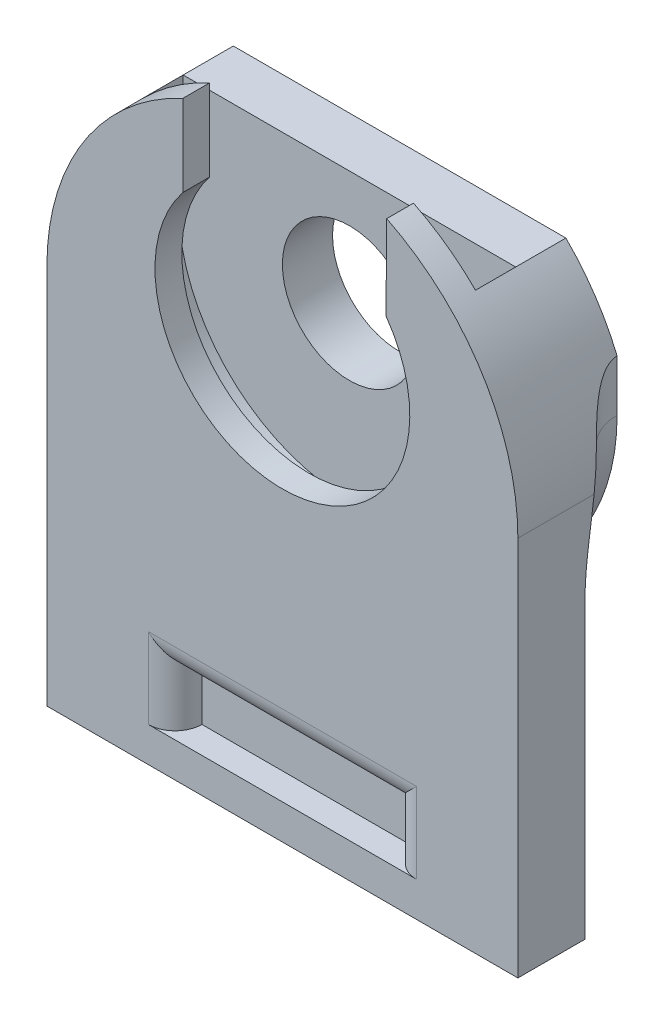
ISO-10303-21;
HEADER;
FILE_DESCRIPTION(('STEP AP214'),'2;1');
FILE_NAME('part.step','',(''),(''),'','','');
FILE_SCHEMA(('AUTOMOTIVE_DESIGN { 1 0 10303 214 1 1 1 1 }'));
ENDSEC;
DATA;
#1=APPLICATION_CONTEXT('core data for automotive mechanical design processes');
#2=APPLICATION_PROTOCOL_DEFINITION('international standard','automotive_design',2000,#1);
#3=PRODUCT_CONTEXT('',#1,'mechanical');
#4=PRODUCT('Part','Part','',(#3));
#5=PRODUCT_RELATED_PRODUCT_CATEGORY('part','',(#4));
#6=PRODUCT_DEFINITION_FORMATION('','',#4);
#7=PRODUCT_DEFINITION_CONTEXT('part definition',#1,'design');
#8=PRODUCT_DEFINITION('design','',#6,#7);
#9=PRODUCT_DEFINITION_SHAPE('','',#8);
#10=(LENGTH_UNIT() NAMED_UNIT(*) SI_UNIT(.MILLI.,.METRE.));
#11=(NAMED_UNIT(*) PLANE_ANGLE_UNIT() SI_UNIT($,.RADIAN.));
#12=(NAMED_UNIT(*) SI_UNIT($,.STERADIAN.) SOLID_ANGLE_UNIT());
#13=UNCERTAINTY_MEASURE_WITH_UNIT(LENGTH_MEASURE(1.E-05),#10,'distance_accuracy_value','');
#14=(GEOMETRIC_REPRESENTATION_CONTEXT(3) GLOBAL_UNCERTAINTY_ASSIGNED_CONTEXT((#13)) GLOBAL_UNIT_ASSIGNED_CONTEXT((#10,
#11,#12)) REPRESENTATION_CONTEXT('',''));
#15=CARTESIAN_POINT('',(0.,0.,0.));
#16=DIRECTION('',(0.,0.,1.));
#17=DIRECTION('',(1.,0.,0.));
#18=AXIS2_PLACEMENT_3D('',#15,#16,#17);
#19=CARTESIAN_POINT('',(8.78,8.5,1.5));
#20=DIRECTION('',(0.,0.,-1.));
#21=DIRECTION('',(-1.,0.,0.));
#22=AXIS2_PLACEMENT_3D('',#19,#20,#21);
#23=CYLINDRICAL_SURFACE('',#22,6.375);
#24=DIRECTION('',(0.,0.,-1.));
#25=VECTOR('',#24,1.);
#26=CARTESIAN_POINT('',(2.58,9.98345036991469,1.5));
#27=LINE('',#26,#25);
#28=CARTESIAN_POINT('',(2.58,9.98345036991469,1.5));
#29=VERTEX_POINT('',#28);
#30=CARTESIAN_POINT('',(2.58,9.98345036991469,0.));
#31=VERTEX_POINT('',#30);
#32=EDGE_CURVE('E260',#29,#31,#27,.T.);
#33=ORIENTED_EDGE('',*,*,#32,.F.);
#34=CARTESIAN_POINT('',(8.78,8.5,1.5));
#35=DIRECTION('',(0.,0.,1.));
#36=DIRECTION('',(1.,0.,0.));
#37=AXIS2_PLACEMENT_3D('',#34,#35,#36);
#38=CIRCLE('',#37,6.375);
#39=CARTESIAN_POINT('',(14.98,9.98345036991469,1.5));
#40=VERTEX_POINT('',#39);
#41=EDGE_CURVE('E265',#29,#40,#38,.T.);
#42=ORIENTED_EDGE('',*,*,#41,.T.);
#43=DIRECTION('',(0.,0.,-1.));
#44=VECTOR('',#43,1.);
#45=CARTESIAN_POINT('',(14.98,9.98345036991469,1.5));
#46=LINE('',#45,#44);
#47=CARTESIAN_POINT('',(14.98,9.98345036991469,0.));
#48=VERTEX_POINT('',#47);
#49=EDGE_CURVE('E263',#48,#40,#46,.F.);
#50=ORIENTED_EDGE('',*,*,#49,.F.);
#51=CARTESIAN_POINT('',(8.78,8.5,0.));
#52=DIRECTION('',(0.,0.,1.));
#53=DIRECTION('',(1.,0.,0.));
#54=AXIS2_PLACEMENT_3D('',#51,#52,#53);
#55=CIRCLE('',#54,6.375);
#56=EDGE_CURVE('E297',#31,#48,#55,.T.);
#57=ORIENTED_EDGE('',*,*,#56,.F.);
#58=EDGE_LOOP('',(#33,#42,#50,#57));
#59=FACE_BOUND('',#58,.T.);
#60=ADVANCED_FACE('F35',(#59),#23,.F.);
#61=CARTESIAN_POINT('',(0.,0.,0.));
#62=DIRECTION('',(0.,0.,1.));
#63=DIRECTION('',(1.,0.,0.));
#64=AXIS2_PLACEMENT_3D('',#61,#62,#63);
#65=PLANE('',#64);
#66=DIRECTION('',(1.,0.,0.));
#67=VECTOR('',#66,1.);
#68=CARTESIAN_POINT('',(0.,-1.87,0.));
#69=LINE('',#68,#67);
#70=CARTESIAN_POINT('',(8.67061038055273,-1.87,0.));
#71=VERTEX_POINT('',#70);
#72=CARTESIAN_POINT('',(8.88938961944725,-1.87,0.));
#73=VERTEX_POINT('',#72);
#74=EDGE_CURVE('E362',#71,#73,#69,.T.);
#75=ORIENTED_EDGE('',*,*,#74,.T.);
#76=CARTESIAN_POINT('',(8.88938961944732,8.,0.));
#77=DIRECTION('',(0.,0.,1.));
#78=DIRECTION('',(1.,0.,0.));
#79=AXIS2_PLACEMENT_3D('',#76,#77,#78);
#80=CIRCLE('',#79,9.87);
#81=CARTESIAN_POINT('',(17.56,3.28434356333583,0.));
#82=VERTEX_POINT('',#81);
#83=EDGE_CURVE('E211',#73,#82,#80,.T.);
#84=ORIENTED_EDGE('',*,*,#83,.T.);
#85=DIRECTION('',(0.,1.,0.));
#86=VECTOR('',#85,1.);
#87=CARTESIAN_POINT('',(17.56,0.,0.));
#88=LINE('',#87,#86);
#89=CARTESIAN_POINT('',(17.56,-7.65,0.));
#90=VERTEX_POINT('',#89);
#91=EDGE_CURVE('E301',#90,#82,#88,.T.);
#92=ORIENTED_EDGE('',*,*,#91,.F.);
#93=DIRECTION('',(1.,0.,0.));
#94=VECTOR('',#93,1.);
#95=CARTESIAN_POINT('',(0.,-7.65,0.));
#96=LINE('',#95,#94);
#97=CARTESIAN_POINT('',(0.,-7.65,0.));
#98=VERTEX_POINT('',#97);
#99=EDGE_CURVE('E321',#98,#90,#96,.T.);
#100=ORIENTED_EDGE('',*,*,#99,.F.);
#101=DIRECTION('',(0.,1.,0.));
#102=VECTOR('',#101,1.);
#103=CARTESIAN_POINT('',(0.,0.,0.));
#104=LINE('',#103,#102);
#105=CARTESIAN_POINT('',(0.,3.28434356333583,0.));
#106=VERTEX_POINT('',#105);
#107=EDGE_CURVE('E307',#98,#106,#104,.T.);
#108=ORIENTED_EDGE('',*,*,#107,.T.);
#109=CARTESIAN_POINT('',(8.67061038055268,8.,0.));
#110=DIRECTION('',(0.,0.,1.));
#111=DIRECTION('',(1.,0.,0.));
#112=AXIS2_PLACEMENT_3D('',#109,#110,#111);
#113=CIRCLE('',#112,9.87);
#114=EDGE_CURVE('E360',#106,#71,#113,.T.);
#115=ORIENTED_EDGE('',*,*,#114,.T.);
#116=EDGE_LOOP('',(#75,#84,#92,#100,#108,#115));
#117=FACE_BOUND('',#116,.T.);
#118=ADVANCED_FACE('F435',(#117),#65,.F.);
#119=CARTESIAN_POINT('',(0.,0.,1.5));
#120=DIRECTION('',(0.,0.,1.));
#121=DIRECTION('',(1.,0.,0.));
#122=AXIS2_PLACEMENT_3D('',#119,#120,#121);
#123=PLANE('',#122);
#124=DIRECTION('',(0.,1.,0.));
#125=VECTOR('',#124,1.);
#126=CARTESIAN_POINT('',(5.07,0.,1.5));
#127=LINE('',#126,#125);
#128=CARTESIAN_POINT('',(5.07,11.466209702634,1.5));
#129=VERTEX_POINT('',#128);
#130=CARTESIAN_POINT('',(5.07,14.5076566902575,1.5));
#131=VERTEX_POINT('',#130);
#132=EDGE_CURVE('E274',#129,#131,#127,.T.);
#133=ORIENTED_EDGE('',*,*,#132,.F.);
#134=CARTESIAN_POINT('',(8.78,8.5,1.5));
#135=DIRECTION('',(0.,0.,-1.));
#136=DIRECTION('',(-1.,0.,0.));
#137=AXIS2_PLACEMENT_3D('',#134,#135,#136);
#138=CIRCLE('',#137,4.75);
#139=CARTESIAN_POINT('',(12.642805753353,11.2642777920939,1.5));
#140=VERTEX_POINT('',#139);
#141=EDGE_CURVE('E303',#140,#129,#138,.T.);
#142=ORIENTED_EDGE('',*,*,#141,.F.);
#143=DIRECTION('',(-0.00807220354177865,-0.999967419234237,0.));
#144=VECTOR('',#143,1.);
#145=CARTESIAN_POINT('',(12.5510573615878,-0.101317990704999,1.5));
#146=LINE('',#145,#144);
#147=CARTESIAN_POINT('',(12.6682969564391,14.4220738549982,1.5));
#148=VERTEX_POINT('',#147);
#149=EDGE_CURVE('E340',#148,#140,#146,.T.);
#150=ORIENTED_EDGE('',*,*,#149,.F.);
#151=CARTESIAN_POINT('',(8.78,6.55,1.5));
#152=DIRECTION('',(0.,0.,1.));
#153=DIRECTION('',(1.,0.,0.));
#154=AXIS2_PLACEMENT_3D('',#151,#152,#153);
#155=CIRCLE('',#154,8.78);
#156=CARTESIAN_POINT('',(14.98,12.7667837343758,1.5));
#157=VERTEX_POINT('',#156);
#158=EDGE_CURVE('E252',#157,#148,#155,.T.);
#159=ORIENTED_EDGE('',*,*,#158,.F.);
#160=DIRECTION('',(0.,-1.,0.));
#161=VECTOR('',#160,1.);
#162=CARTESIAN_POINT('',(14.98,8.50000000000001,1.5));
#163=LINE('',#162,#161);
#164=EDGE_CURVE('E249',#157,#40,#163,.T.);
#165=ORIENTED_EDGE('',*,*,#164,.T.);
#166=ORIENTED_EDGE('',*,*,#41,.F.);
#167=DIRECTION('',(0.,1.,0.));
#168=VECTOR('',#167,1.);
#169=CARTESIAN_POINT('',(2.58,8.50000000000001,1.5));
#170=LINE('',#169,#168);
#171=CARTESIAN_POINT('',(2.58,12.7667837343758,1.5));
#172=VERTEX_POINT('',#171);
#173=EDGE_CURVE('E246',#29,#172,#170,.T.);
#174=ORIENTED_EDGE('',*,*,#173,.T.);
#175=CARTESIAN_POINT('',(8.78,6.55,1.5));
#176=DIRECTION('',(0.,0.,1.));
#177=DIRECTION('',(1.,0.,0.));
#178=AXIS2_PLACEMENT_3D('',#175,#176,#177);
#179=CIRCLE('',#178,8.78);
#180=EDGE_CURVE('E257',#131,#172,#179,.T.);
#181=ORIENTED_EDGE('',*,*,#180,.F.);
#182=EDGE_LOOP('',(#133,#142,#150,#159,#165,#166,#174,#181));
#183=FACE_BOUND('',#182,.T.);
#184=ADVANCED_FACE('F440',(#183),#123,.F.);
#185=CARTESIAN_POINT('',(0.,0.,2.5));
#186=DIRECTION('',(0.,0.,1.));
#187=DIRECTION('',(1.,0.,0.));
#188=AXIS2_PLACEMENT_3D('',#185,#186,#187);
#189=PLANE('',#188);
#190=DIRECTION('',(0.,1.,0.));
#191=VECTOR('',#190,1.);
#192=CARTESIAN_POINT('',(13.78,-6.35316683145248,2.5));
#193=LINE('',#192,#191);
#194=CARTESIAN_POINT('',(13.78,-3.35316683145248,2.5));
#195=VERTEX_POINT('',#194);
#196=CARTESIAN_POINT('',(13.78,-6.35316683145248,2.5));
#197=VERTEX_POINT('',#196);
#198=EDGE_CURVE('E294',#195,#197,#193,.F.);
#199=ORIENTED_EDGE('',*,*,#198,.T.);
#200=DIRECTION('',(1.,0.,0.));
#201=VECTOR('',#200,1.);
#202=CARTESIAN_POINT('',(12.78,-6.35316683145248,2.5));
#203=LINE('',#202,#201);
#204=CARTESIAN_POINT('',(3.78,-6.35316683145248,2.5));
#205=VERTEX_POINT('',#204);
#206=EDGE_CURVE('E287',#205,#197,#203,.T.);
#207=ORIENTED_EDGE('',*,*,#206,.F.);
#208=DIRECTION('',(0.,-1.,0.));
#209=VECTOR('',#208,1.);
#210=CARTESIAN_POINT('',(3.78,-4.35316683145248,2.5));
#211=LINE('',#210,#209);
#212=CARTESIAN_POINT('',(3.78,-3.35316683145248,2.5));
#213=VERTEX_POINT('',#212);
#214=EDGE_CURVE('E291',#205,#213,#211,.F.);
#215=ORIENTED_EDGE('',*,*,#214,.T.);
#216=DIRECTION('',(-1.,0.,0.));
#217=VECTOR('',#216,1.);
#218=CARTESIAN_POINT('',(12.78,-3.35316683145248,2.5));
#219=LINE('',#218,#217);
#220=EDGE_CURVE('E293',#213,#195,#219,.F.);
#221=ORIENTED_EDGE('',*,*,#220,.T.);
#222=EDGE_LOOP('',(#199,#207,#215,#221));
#223=FACE_BOUND('',#222,.T.);
#224=CARTESIAN_POINT('',(8.78,6.55,2.5));
#225=DIRECTION('',(0.,0.,1.));
#226=DIRECTION('',(1.,0.,0.));
#227=AXIS2_PLACEMENT_3D('',#224,#225,#226);
#228=CIRCLE('',#227,8.78);
#229=CARTESIAN_POINT('',(17.56,6.55,2.5));
#230=VERTEX_POINT('',#229);
#231=CARTESIAN_POINT('',(12.6682969564391,14.4220738549982,2.5));
#232=VERTEX_POINT('',#231);
#233=EDGE_CURVE('E299',#230,#232,#228,.T.);
#234=ORIENTED_EDGE('',*,*,#233,.T.);
#235=DIRECTION('',(-0.00807220354177865,-0.999967419234237,0.));
#236=VECTOR('',#235,1.);
#237=CARTESIAN_POINT('',(12.6696430470026,14.588824693216,2.5));
#238=LINE('',#237,#236);
#239=CARTESIAN_POINT('',(12.642805753353,11.2642777920939,2.5));
#240=VERTEX_POINT('',#239);
#241=EDGE_CURVE('E345',#232,#240,#238,.T.);
#242=ORIENTED_EDGE('',*,*,#241,.T.);
#243=CARTESIAN_POINT('',(8.78,8.5,2.5));
#244=DIRECTION('',(0.,0.,-1.));
#245=DIRECTION('',(-1.,0.,0.));
#246=AXIS2_PLACEMENT_3D('',#243,#244,#245);
#247=CIRCLE('',#246,4.75);
#248=CARTESIAN_POINT('',(5.07,11.466209702634,2.5));
#249=VERTEX_POINT('',#248);
#250=EDGE_CURVE('E317',#240,#249,#247,.T.);
#251=ORIENTED_EDGE('',*,*,#250,.T.);
#252=DIRECTION('',(0.,-1.,0.));
#253=VECTOR('',#252,1.);
#254=CARTESIAN_POINT('',(5.07,14.6194981256581,2.5));
#255=LINE('',#254,#253);
#256=CARTESIAN_POINT('',(5.07,14.5076566902575,2.5));
#257=VERTEX_POINT('',#256);
#258=EDGE_CURVE('E275',#257,#249,#255,.T.);
#259=ORIENTED_EDGE('',*,*,#258,.F.);
#260=CARTESIAN_POINT('',(8.78,6.55,2.5));
#261=DIRECTION('',(0.,0.,1.));
#262=DIRECTION('',(1.,0.,0.));
#263=AXIS2_PLACEMENT_3D('',#260,#261,#262);
#264=CIRCLE('',#263,8.78);
#265=CARTESIAN_POINT('',(0.,6.55,2.5));
#266=VERTEX_POINT('',#265);
#267=EDGE_CURVE('E315',#257,#266,#264,.T.);
#268=ORIENTED_EDGE('',*,*,#267,.T.);
#269=DIRECTION('',(0.,-1.,0.));
#270=VECTOR('',#269,1.);
#271=CARTESIAN_POINT('',(0.,0.,2.5));
#272=LINE('',#271,#270);
#273=CARTESIAN_POINT('',(0.,-7.65,2.5));
#274=VERTEX_POINT('',#273);
#275=EDGE_CURVE('E313',#266,#274,#272,.T.);
#276=ORIENTED_EDGE('',*,*,#275,.T.);
#277=DIRECTION('',(-1.,0.,0.));
#278=VECTOR('',#277,1.);
#279=CARTESIAN_POINT('',(17.56,-7.65,2.5));
#280=LINE('',#279,#278);
#281=CARTESIAN_POINT('',(17.56,-7.65,2.5));
#282=VERTEX_POINT('',#281);
#283=EDGE_CURVE('E306',#282,#274,#280,.T.);
#284=ORIENTED_EDGE('',*,*,#283,.F.);
#285=DIRECTION('',(0.,1.,0.));
#286=VECTOR('',#285,1.);
#287=CARTESIAN_POINT('',(17.56,0.,2.5));
#288=LINE('',#287,#286);
#289=EDGE_CURVE('E310',#282,#230,#288,.T.);
#290=ORIENTED_EDGE('',*,*,#289,.T.);
#291=EDGE_LOOP('',(#234,#242,#251,#259,#268,#276,#284,#290));
#292=FACE_BOUND('',#291,.T.);
#293=ADVANCED_FACE('F481',(#223,#292),#189,.T.);
#294=CARTESIAN_POINT('',(8.78,8.5,2.5));
#295=DIRECTION('',(0.,0.,-1.));
#296=DIRECTION('',(-1.,0.,0.));
#297=AXIS2_PLACEMENT_3D('',#294,#295,#296);
#298=CYLINDRICAL_SURFACE('',#297,4.75);
#299=DIRECTION('',(0.,0.,-1.));
#300=VECTOR('',#299,1.);
#301=CARTESIAN_POINT('',(12.642805753353,11.2642777920939,2.5));
#302=LINE('',#301,#300);
#303=EDGE_CURVE('E270',#140,#240,#302,.F.);
#304=ORIENTED_EDGE('',*,*,#303,.F.);
#305=ORIENTED_EDGE('',*,*,#141,.T.);
#306=DIRECTION('',(0.,0.,-1.));
#307=VECTOR('',#306,1.);
#308=CARTESIAN_POINT('',(5.07,11.466209702634,2.5));
#309=LINE('',#308,#307);
#310=EDGE_CURVE('E271',#249,#129,#309,.T.);
#311=ORIENTED_EDGE('',*,*,#310,.F.);
#312=ORIENTED_EDGE('',*,*,#250,.F.);
#313=EDGE_LOOP('',(#304,#305,#311,#312));
#314=FACE_BOUND('',#313,.T.);
#315=ADVANCED_FACE('F477',(#314),#298,.F.);
#316=CARTESIAN_POINT('',(8.78,6.55,1.5));
#317=DIRECTION('',(0.,0.,-1.));
#318=DIRECTION('',(-1.,0.,0.));
#319=AXIS2_PLACEMENT_3D('',#316,#317,#318);
#320=CYLINDRICAL_SURFACE('',#319,8.78);
#321=DIRECTION('',(0.,0.,-1.));
#322=VECTOR('',#321,1.);
#323=CARTESIAN_POINT('',(17.56,6.55,1.5));
#324=LINE('',#323,#322);
#325=CARTESIAN_POINT('',(17.56,6.55,-0.342683321896948));
#326=VERTEX_POINT('',#325);
#327=EDGE_CURVE('E60',#230,#326,#324,.T.);
#328=ORIENTED_EDGE('',*,*,#327,.T.);
#329=CARTESIAN_POINT('',(17.56,6.55,-0.342683321896974));
#330=CARTESIAN_POINT('',(17.5599994901147,6.67037660131197,-0.35671167158142));
#331=CARTESIAN_POINT('',(17.5575236596443,6.79066400091637,-0.371332129180917));
#332=CARTESIAN_POINT('',(17.5476461540936,7.03087339045183,-0.401855343694858));
#333=CARTESIAN_POINT('',(17.5402444716129,7.15079537983364,-0.417758102535736));
#334=CARTESIAN_POINT('',(17.5108337070411,7.50796091414598,-0.467291244716296));
#335=CARTESIAN_POINT('',(17.4816176288962,7.74439159734278,-0.502951421287838));
#336=CARTESIAN_POINT('',(17.423687478412,8.09569152314312,-0.561242833021924));
#337=CARTESIAN_POINT('',(17.4020377408094,8.21218851916515,-0.581464572327461));
#338=CARTESIAN_POINT('',(17.3541179059053,8.44390919805024,-0.623703887528542));
#339=CARTESIAN_POINT('',(17.3278478931744,8.5591329041789,-0.645721430549274));
#340=CARTESIAN_POINT('',(17.2705804806016,8.78887359493945,-0.691938212187154));
#341=CARTESIAN_POINT('',(17.2395503218659,8.90337947248323,-0.716152053438081));
#342=CARTESIAN_POINT('',(17.1730401995582,9.1305634459637,-0.766968874434136));
#343=CARTESIAN_POINT('',(17.1375598778429,9.24324139396584,-0.793572046420489));
#344=CARTESIAN_POINT('',(17.0999255557617,9.35485984437417,-0.821540206190086));
#345=B_SPLINE_CURVE_WITH_KNOTS('',3,(#329,#330,#331,#332,#333,#334,#335,#336,#337,#338,#339,
#340,#341,#342,#343,#344),.UNSPECIFIED.,.F.,.F.,(4,2,2,2,2,2,2,4),(0.,0.363506662577323,
0.727013871270572,1.44864682998518,1.80917898034457,2.16970453211661,2.53283279418548,
2.89599029911484),.UNSPECIFIED.);
#346=CARTESIAN_POINT('',(17.4394399356999,8.00000000000208,-0.545374455789477));
#347=VERTEX_POINT('',#346);
#348=EDGE_CURVE('E421',#326,#347,#345,.T.);
#349=ORIENTED_EDGE('',*,*,#348,.T.);
#350=CARTESIAN_POINT('',(17.4394399356999,8.00000000000208,-0.545374455789477));
#351=CARTESIAN_POINT('',(17.4313492092322,8.04831940742578,-0.553438926138364));
#352=CARTESIAN_POINT('',(17.422868242472,8.09648283253569,-0.562034990228973));
#353=CARTESIAN_POINT('',(17.4051447896824,8.19245522292477,-0.58039360138816));
#354=CARTESIAN_POINT('',(17.3959021597235,8.24026411934049,-0.590156369083462));
#355=CARTESIAN_POINT('',(17.3669888688589,8.38344513482413,-0.621427269915909));
#356=CARTESIAN_POINT('',(17.3461972466878,8.47818771111612,-0.644855724289133));
#357=CARTESIAN_POINT('',(17.3017019626057,8.66622837993129,-0.698136139538963));
#358=CARTESIAN_POINT('',(17.2779716599578,8.75950308598486,-0.728049037880533));
#359=CARTESIAN_POINT('',(17.2282798957079,8.94247022245388,-0.795585259795686));
#360=CARTESIAN_POINT('',(17.2023228238173,9.03216921253757,-0.833193607060311));
#361=CARTESIAN_POINT('',(17.1564131451809,9.18219319961071,-0.906324830809631));
#362=CARTESIAN_POINT('',(17.1367983878255,9.24374937799241,-0.939518656869987));
#363=CARTESIAN_POINT('',(17.0973576667259,9.36316626285291,-1.01194827523123));
#364=CARTESIAN_POINT('',(17.0775317757331,9.42102819708214,-1.05118204526517));
#365=CARTESIAN_POINT('',(17.038273216599,9.53208391121,-1.13724886848081));
#366=CARTESIAN_POINT('',(17.0188467391315,9.58522319916312,-1.18415634623671));
#367=CARTESIAN_POINT('',(16.9819568190609,9.68353505809272,-1.286415761797));
#368=CARTESIAN_POINT('',(16.9644887367788,9.72872660929825,-1.3417469758253));
#369=CARTESIAN_POINT('',(16.939185814112,9.79296490934671,-1.43954083091247));
#370=CARTESIAN_POINT('',(16.930158421708,9.8155417681463,-1.47936094232775));
#371=CARTESIAN_POINT('',(16.9144089988451,9.85457725174302,-1.56223549444583));
#372=CARTESIAN_POINT('',(16.9076804105711,9.87105329185363,-1.60528030037213));
#373=CARTESIAN_POINT('',(16.8971431702515,9.89672796570826,-1.6941140832135));
#374=CARTESIAN_POINT('',(16.8933470483979,9.90589537554783,-1.73991394450203));
#375=CARTESIAN_POINT('',(16.8902165472607,9.9134495340228,-1.80961598706448));
#376=CARTESIAN_POINT('',(16.8896045170286,9.91492460711805,-1.83316075952621));
#377=CARTESIAN_POINT('',(16.8892687923697,9.91573275972128,-1.88031298597487));
#378=CARTESIAN_POINT('',(16.8895458469869,9.91506403310261,-1.90392047606359));
#379=CARTESIAN_POINT('',(16.8902722385397,9.91331446890884,-1.92744750986062));
#380=B_SPLINE_CURVE_WITH_KNOTS('',3,(#350,#351,#352,#353,#354,#355,#356,#357,#358,#359,#360,
#361,#362,#363,#364,#365,#366,#367,#368,#369,#370,#371,#372,#373,#374,#375,#376,#377,#378,#379),
.UNSPECIFIED.,.F.,.F.,(4,2,2,2,2,2,2,2,2,2,2,2,2,2,4),(0.,0.148944471673248,0.297917153840309,
0.597043230068733,0.899112638413519,1.20059967942839,1.41823669194327,1.63580099405584,
1.85561627933959,2.07489927008526,2.21439905579188,2.35349750001322,2.49318706253206,
2.56388166073484,2.63463583397283),.UNSPECIFIED.);
#381=CARTESIAN_POINT('',(16.8893896194473,9.9154420214884,-1.87));
#382=VERTEX_POINT('',#381);
#383=EDGE_CURVE('E372',#347,#382,#380,.T.);
#384=ORIENTED_EDGE('',*,*,#383,.T.);
#385=CARTESIAN_POINT('',(8.78,6.55,-1.87));
#386=DIRECTION('',(0.,0.,-1.));
#387=DIRECTION('',(-1.,0.,0.));
#388=AXIS2_PLACEMENT_3D('',#385,#386,#387);
#389=CIRCLE('',#388,8.78);
#390=CARTESIAN_POINT('',(14.98,12.7667837343758,-1.87));
#391=VERTEX_POINT('',#390);
#392=EDGE_CURVE('E231',#391,#382,#389,.T.);
#393=ORIENTED_EDGE('',*,*,#392,.F.);
#394=DIRECTION('',(0.,0.,1.));
#395=VECTOR('',#394,1.);
#396=CARTESIAN_POINT('',(14.98,12.7667837343758,-1.87));
#397=LINE('',#396,#395);
#398=CARTESIAN_POINT('',(14.98,12.7667837343758,0.));
#399=VERTEX_POINT('',#398);
#400=EDGE_CURVE('E234',#391,#399,#397,.T.);
#401=ORIENTED_EDGE('',*,*,#400,.T.);
#402=DIRECTION('',(0.,0.,-1.));
#403=VECTOR('',#402,1.);
#404=CARTESIAN_POINT('',(14.98,12.7667837343758,1.5));
#405=LINE('',#404,#403);
#406=EDGE_CURVE('E357',#399,#157,#405,.F.);
#407=ORIENTED_EDGE('',*,*,#406,.T.);
#408=ORIENTED_EDGE('',*,*,#158,.T.);
#409=DIRECTION('',(0.,0.,-1.));
#410=VECTOR('',#409,1.);
#411=CARTESIAN_POINT('',(12.6682969564391,14.4220738549982,1.5));
#412=LINE('',#411,#410);
#413=EDGE_CURVE('E266',#232,#148,#412,.T.);
#414=ORIENTED_EDGE('',*,*,#413,.F.);
#415=ORIENTED_EDGE('',*,*,#233,.F.);
#416=EDGE_LOOP('',(#328,#349,#384,#393,#401,#407,#408,#414,#415));
#417=FACE_BOUND('',#416,.T.);
#418=ADVANCED_FACE('F454',(#417),#320,.T.);
#419=CARTESIAN_POINT('',(8.78,6.55,1.5));
#420=DIRECTION('',(0.,0.,-1.));
#421=DIRECTION('',(-1.,0.,0.));
#422=AXIS2_PLACEMENT_3D('',#419,#420,#421);
#423=CYLINDRICAL_SURFACE('',#422,8.78);
#424=DIRECTION('',(0.,0.,-1.));
#425=VECTOR('',#424,1.);
#426=CARTESIAN_POINT('',(5.07,14.5076566902575,1.5));
#427=LINE('',#426,#425);
#428=EDGE_CURVE('E283',#131,#257,#427,.F.);
#429=ORIENTED_EDGE('',*,*,#428,.F.);
#430=ORIENTED_EDGE('',*,*,#180,.T.);
#431=DIRECTION('',(0.,0.,-1.));
#432=VECTOR('',#431,1.);
#433=CARTESIAN_POINT('',(2.58,12.7667837343758,1.5));
#434=LINE('',#433,#432);
#435=CARTESIAN_POINT('',(2.58,12.7667837343758,0.));
#436=VERTEX_POINT('',#435);
#437=EDGE_CURVE('E269',#172,#436,#434,.T.);
#438=ORIENTED_EDGE('',*,*,#437,.T.);
#439=DIRECTION('',(0.,0.,1.));
#440=VECTOR('',#439,1.);
#441=CARTESIAN_POINT('',(2.58,12.7667837343758,-1.87));
#442=LINE('',#441,#440);
#443=CARTESIAN_POINT('',(2.58,12.7667837343758,-1.87));
#444=VERTEX_POINT('',#443);
#445=EDGE_CURVE('E240',#444,#436,#442,.T.);
#446=ORIENTED_EDGE('',*,*,#445,.F.);
#447=CARTESIAN_POINT('',(8.78,6.55,-1.87));
#448=DIRECTION('',(0.,0.,-1.));
#449=DIRECTION('',(-1.,0.,0.));
#450=AXIS2_PLACEMENT_3D('',#447,#448,#449);
#451=CIRCLE('',#450,8.78);
#452=CARTESIAN_POINT('',(0.670610380552677,9.91544202148841,-1.87));
#453=VERTEX_POINT('',#452);
#454=EDGE_CURVE('E226',#453,#444,#451,.T.);
#455=ORIENTED_EDGE('',*,*,#454,.F.);
#456=CARTESIAN_POINT('',(0.668574246216782,9.91053154141758,-1.95724102574605));
#457=CARTESIAN_POINT('',(0.669637266437838,9.91309566442957,-1.93453646458993));
#458=CARTESIAN_POINT('',(0.670285155196744,9.91465796978972,-1.91171124752391));
#459=CARTESIAN_POINT('',(0.670745323934187,9.91576755154494,-1.86601506088757));
#460=CARTESIAN_POINT('',(0.670558022752208,9.91531583795058,-1.84314411999819));
#461=CARTESIAN_POINT('',(0.668748496443996,9.91095434587247,-1.77517932451049));
#462=CARTESIAN_POINT('',(0.665900017600316,9.90408970081317,-1.73027040995493));
#463=CARTESIAN_POINT('',(0.657688642889688,9.88414994746057,-1.64697014208983));
#464=CARTESIAN_POINT('',(0.652606542100225,9.87176666766074,-1.60837681918617));
#465=CARTESIAN_POINT('',(0.640474975377311,9.84192844824091,-1.53348928323959));
#466=CARTESIAN_POINT('',(0.633422262597887,9.82446513662249,-1.49719898687493));
#467=CARTESIAN_POINT('',(0.613459817513214,9.77445117889697,-1.40784370521535));
#468=CARTESIAN_POINT('',(0.599475861303856,9.7389149473601,-1.35669470625745));
#469=CARTESIAN_POINT('',(0.569381365874678,9.66061191008407,-1.2609995795924));
#470=CARTESIAN_POINT('',(0.553265833219267,9.61782805786481,-1.21646949426672));
#471=CARTESIAN_POINT('',(0.52289567483364,9.53500068145668,-1.14061771492489));
#472=CARTESIAN_POINT('',(0.508799018802626,9.49575571224746,-1.10834229541814));
#473=CARTESIAN_POINT('',(0.480335315204584,9.41458086067518,-1.04747286054602));
#474=CARTESIAN_POINT('',(0.465968081523359,9.37264907875875,-1.01888149374774));
#475=CARTESIAN_POINT('',(0.422810663200826,9.24333022805001,-0.937711110250847));
#476=CARTESIAN_POINT('',(0.394109580259526,9.15280864828365,-0.890071238200182));
#477=CARTESIAN_POINT('',(0.341309050656537,8.97582346158959,-0.809234521511248));
#478=CARTESIAN_POINT('',(0.317034111093984,8.88982915781888,-0.775080685751628));
#479=CARTESIAN_POINT('',(0.270579796953126,8.71480294108996,-0.713462903920962));
#480=CARTESIAN_POINT('',(0.248403340874497,8.62576702539989,-0.686008193421007));
#481=CARTESIAN_POINT('',(0.207110553322554,8.44791647980675,-0.637256179848887));
#482=CARTESIAN_POINT('',(0.187930786600442,8.35915370602928,-0.615820153260509));
#483=CARTESIAN_POINT('',(0.152228616971557,8.18042325431223,-0.577453449410562));
#484=CARTESIAN_POINT('',(0.135698196229927,8.09046013993788,-0.560509073014441));
#485=CARTESIAN_POINT('',(0.120560064300119,8.00000000000208,-0.545374455789476));
#486=B_SPLINE_CURVE_WITH_KNOTS('',3,(#456,#457,#458,#459,#460,#461,#462,#463,#464,#465,#466,
#467,#468,#469,#470,#471,#472,#473,#474,#475,#476,#477,#478,#479,#480,#481,#482,#483,#484,#485),
.UNSPECIFIED.,.F.,.F.,(4,2,2,2,2,2,2,2,2,2,2,2,2,2,4),(0.,0.0685711290046482,0.137107874135651,
0.272805001088586,0.394894208546372,0.517185772627119,0.707596115725178,0.898460687232061,
1.05643012156765,1.21451249824839,1.53226096749924,1.81892552480614,2.10598307958675,
2.38574707910982,2.66464774162535),.UNSPECIFIED.);
#487=CARTESIAN_POINT('',(0.120560064300118,8.00000000000208,-0.545374455789476));
#488=VERTEX_POINT('',#487);
#489=EDGE_CURVE('E365',#453,#488,#486,.T.);
#490=ORIENTED_EDGE('',*,*,#489,.T.);
#491=CARTESIAN_POINT('',(0.,6.55,-0.342683321896972));
#492=CARTESIAN_POINT('',(5.09885339388758E-07,6.67037660131197,-0.356711671581418));
#493=CARTESIAN_POINT('',(0.00247634035572597,6.79066400091637,-0.371332129180916));
#494=CARTESIAN_POINT('',(0.0123538459064164,7.03087339045183,-0.401855343694856));
#495=CARTESIAN_POINT('',(0.0197555283870802,7.15079537983364,-0.417758102535735));
#496=CARTESIAN_POINT('',(0.0491662929589439,7.50796091414598,-0.467291244716295));
#497=CARTESIAN_POINT('',(0.0783823711038133,7.74439159734278,-0.502951421287836));
#498=CARTESIAN_POINT('',(0.136312521588047,8.09569152314312,-0.561242833021922));
#499=CARTESIAN_POINT('',(0.157962259190568,8.21218851916515,-0.581464572327459));
#500=CARTESIAN_POINT('',(0.205882094094724,8.44390919805024,-0.62370388752854));
#501=CARTESIAN_POINT('',(0.232152106825645,8.5591329041789,-0.645721430549271));
#502=CARTESIAN_POINT('',(0.28941951939841,8.78887359493945,-0.691938212187153));
#503=CARTESIAN_POINT('',(0.320449678134065,8.90337947248323,-0.716152053438082));
#504=CARTESIAN_POINT('',(0.386959800441762,9.1305634459637,-0.766968874434139));
#505=CARTESIAN_POINT('',(0.422440122157086,9.24324139396584,-0.793572046420492));
#506=CARTESIAN_POINT('',(0.460074444238259,9.35485984437417,-0.821540206190086));
#507=B_SPLINE_CURVE_WITH_KNOTS('',3,(#491,#492,#493,#494,#495,#496,#497,#498,#499,#500,#501,
#502,#503,#504,#505,#506),.UNSPECIFIED.,.F.,.F.,(4,2,2,2,2,2,2,4),(0.,0.363506662577322,
0.727013871270571,1.44864682998518,1.80917898034457,2.16970453211661,2.53283279418548,
2.89599029911484),.UNSPECIFIED.);
#508=CARTESIAN_POINT('',(0.,6.55,-0.342683321896972));
#509=VERTEX_POINT('',#508);
#510=EDGE_CURVE('E45',#488,#509,#507,.F.);
#511=ORIENTED_EDGE('',*,*,#510,.T.);
#512=DIRECTION('',(0.,0.,-1.));
#513=VECTOR('',#512,1.);
#514=CARTESIAN_POINT('',(0.,6.55,1.5));
#515=LINE('',#514,#513);
#516=EDGE_CURVE('E52',#266,#509,#515,.T.);
#517=ORIENTED_EDGE('',*,*,#516,.F.);
#518=ORIENTED_EDGE('',*,*,#267,.F.);
#519=EDGE_LOOP('',(#429,#430,#438,#446,#455,#490,#511,#517,#518));
#520=FACE_BOUND('',#519,.T.);
#521=ADVANCED_FACE('F378',(#520),#423,.T.);
#522=CARTESIAN_POINT('',(0.,0.,1.5));
#523=DIRECTION('',(-1.,0.,0.));
#524=DIRECTION('',(0.,0.,1.));
#525=AXIS2_PLACEMENT_3D('',#522,#523,#524);
#526=PLANE('',#525);
#527=ORIENTED_EDGE('',*,*,#107,.F.);
#528=DIRECTION('',(0.,0.,-1.));
#529=VECTOR('',#528,1.);
#530=CARTESIAN_POINT('',(0.,-7.65,2.5));
#531=LINE('',#530,#529);
#532=EDGE_CURVE('E324',#274,#98,#531,.T.);
#533=ORIENTED_EDGE('',*,*,#532,.F.);
#534=ORIENTED_EDGE('',*,*,#275,.F.);
#535=ORIENTED_EDGE('',*,*,#516,.T.);
#536=CARTESIAN_POINT('',(0.,8.24623317085214,-0.432384761226297));
#537=CARTESIAN_POINT('',(0.,8.14212343520078,-0.434873969911642));
#538=CARTESIAN_POINT('',(0.,8.03797781204468,-0.435761070422597));
#539=CARTESIAN_POINT('',(0.,7.82972652306614,-0.434416826506297));
#540=CARTESIAN_POINT('',(0.,7.72562085341184,-0.43218608845879));
#541=CARTESIAN_POINT('',(0.,7.51776014670718,-0.424701464265922));
#542=CARTESIAN_POINT('',(0.,7.41400485415441,-0.419454548678275));
#543=CARTESIAN_POINT('',(0.,7.20666721769006,-0.406232643636676));
#544=CARTESIAN_POINT('',(0.,7.10308488091215,-0.398257544320156));
#545=CARTESIAN_POINT('',(0.,6.79271424316046,-0.370820516475735));
#546=CARTESIAN_POINT('',(0.,6.58624061829506,-0.347844210416917));
#547=CARTESIAN_POINT('',(0.,6.17385173845403,-0.296514399462921));
#548=CARTESIAN_POINT('',(0.,5.96793703448235,-0.268156776034671));
#549=CARTESIAN_POINT('',(0.,5.55660103223521,-0.210460862015951));
#550=CARTESIAN_POINT('',(0.,5.35117948640192,-0.181124300012394));
#551=CARTESIAN_POINT('',(0.,4.94004696038501,-0.125583209737976));
#552=CARTESIAN_POINT('',(0.,4.73433629131951,-0.0993764615353195));
#553=CARTESIAN_POINT('',(0.,4.32186927571233,-0.0540463802113034));
#554=CARTESIAN_POINT('',(0.,4.1151121011106,-0.0349300235672925));
#555=CARTESIAN_POINT('',(0.,3.80420063221257,-0.014666401360789));
#556=CARTESIAN_POINT('',(0.,3.70032678131389,-0.00931251427190666));
#557=CARTESIAN_POINT('',(0.,3.49242387556682,-0.0019816104434819));
#558=CARTESIAN_POINT('',(0.,3.38839477703521,-5.86468159869899E-06));
#559=CARTESIAN_POINT('',(0.,3.28434356333584,0.));
#560=B_SPLINE_CURVE_WITH_KNOTS('',3,(#536,#537,#538,#539,#540,#541,#542,#543,#544,#545,#546,
#547,#548,#549,#550,#551,#552,#553,#554,#555,#556,#557,#558,#559),.UNSPECIFIED.,.F.,.F.,(4,2,2,
2,2,2,2,2,2,2,2,4),(0.,0.31240283192424,0.624744913944739,0.93636804115971,1.2480037187565,
1.87109001773678,2.49465512650733,3.11717204924971,3.73924477384515,4.36192796337146,
4.67391302604543,4.98601544285692),.UNSPECIFIED.);
#561=EDGE_CURVE('E11',#509,#106,#560,.T.);
#562=ORIENTED_EDGE('',*,*,#561,.T.);
#563=EDGE_LOOP('',(#527,#533,#534,#535,#562));
#564=FACE_BOUND('',#563,.T.);
#565=ADVANCED_FACE('F406',(#564),#526,.T.);
#566=CARTESIAN_POINT('',(17.56,0.,1.5));
#567=DIRECTION('',(-1.,0.,0.));
#568=DIRECTION('',(0.,0.,1.));
#569=AXIS2_PLACEMENT_3D('',#566,#567,#568);
#570=PLANE('',#569);
#571=ORIENTED_EDGE('',*,*,#91,.T.);
#572=CARTESIAN_POINT('',(17.56,8.24623317085216,-0.432384761226298));
#573=CARTESIAN_POINT('',(17.56,8.1421234352008,-0.434873969911643));
#574=CARTESIAN_POINT('',(17.56,8.03797781204469,-0.435761070422598));
#575=CARTESIAN_POINT('',(17.56,7.82972652306616,-0.434416826506299));
#576=CARTESIAN_POINT('',(17.56,7.72562085341186,-0.432186088458791));
#577=CARTESIAN_POINT('',(17.56,7.5177601467072,-0.424701464265923));
#578=CARTESIAN_POINT('',(17.56,7.41400485415443,-0.419454548678277));
#579=CARTESIAN_POINT('',(17.56,7.20666721769007,-0.406232643636677));
#580=CARTESIAN_POINT('',(17.56,7.10308488091216,-0.398257544320158));
#581=CARTESIAN_POINT('',(17.56,6.79271424316047,-0.370820516475739));
#582=CARTESIAN_POINT('',(17.56,6.58624061829507,-0.34784421041692));
#583=CARTESIAN_POINT('',(17.56,6.17385173845404,-0.296514399462923));
#584=CARTESIAN_POINT('',(17.56,5.96793703448236,-0.268156776034674));
#585=CARTESIAN_POINT('',(17.56,5.55660103223522,-0.210460862015953));
#586=CARTESIAN_POINT('',(17.56,5.35117948640193,-0.181124300012396));
#587=CARTESIAN_POINT('',(17.56,4.94004696038501,-0.125583209737977));
#588=CARTESIAN_POINT('',(17.56,4.73433629131951,-0.0993764615353203));
#589=CARTESIAN_POINT('',(17.56,4.32186927571233,-0.0540463802113035));
#590=CARTESIAN_POINT('',(17.56,4.1151121011106,-0.0349300235672925));
#591=CARTESIAN_POINT('',(17.56,3.80420063221256,-0.0146664013607889));
#592=CARTESIAN_POINT('',(17.56,3.70032678131389,-0.00931251427190665));
#593=CARTESIAN_POINT('',(17.56,3.49242387556681,-0.00198161044348192));
#594=CARTESIAN_POINT('',(17.56,3.3883947770352,-5.86468159875497E-06));
#595=CARTESIAN_POINT('',(17.56,3.28434356333583,0.));
#596=B_SPLINE_CURVE_WITH_KNOTS('',3,(#572,#573,#574,#575,#576,#577,#578,#579,#580,#581,#582,
#583,#584,#585,#586,#587,#588,#589,#590,#591,#592,#593,#594,#595),.UNSPECIFIED.,.F.,.F.,(4,2,2,
2,2,2,2,2,2,2,2,4),(0.,0.312402831924244,0.624744913944743,0.936368041159715,1.2480037187565,
1.87109001773679,2.49465512650734,3.11717204924972,3.73924477384516,4.36192796337148,
4.67391302604545,4.98601544285695),.UNSPECIFIED.);
#597=EDGE_CURVE('E417',#82,#326,#596,.F.);
#598=ORIENTED_EDGE('',*,*,#597,.T.);
#599=ORIENTED_EDGE('',*,*,#327,.F.);
#600=ORIENTED_EDGE('',*,*,#289,.F.);
#601=DIRECTION('',(0.,0.,1.));
#602=VECTOR('',#601,1.);
#603=CARTESIAN_POINT('',(17.56,-7.65,0.));
#604=LINE('',#603,#602);
#605=EDGE_CURVE('E318',#90,#282,#604,.T.);
#606=ORIENTED_EDGE('',*,*,#605,.F.);
#607=EDGE_LOOP('',(#571,#598,#599,#600,#606));
#608=FACE_BOUND('',#607,.T.);
#609=ADVANCED_FACE('F410',(#608),#570,.F.);
#610=CARTESIAN_POINT('',(0.,-7.65,0.));
#611=DIRECTION('',(0.,-1.,0.));
#612=DIRECTION('',(0.,0.,-1.));
#613=AXIS2_PLACEMENT_3D('',#610,#611,#612);
#614=PLANE('',#613);
#615=ORIENTED_EDGE('',*,*,#283,.T.);
#616=ORIENTED_EDGE('',*,*,#532,.T.);
#617=ORIENTED_EDGE('',*,*,#99,.T.);
#618=ORIENTED_EDGE('',*,*,#605,.T.);
#619=EDGE_LOOP('',(#615,#616,#617,#618));
#620=FACE_BOUND('',#619,.T.);
#621=ADVANCED_FACE('F414',(#620),#614,.T.);
#622=CARTESIAN_POINT('',(12.78,-6.35316683145248,1.5));
#623=DIRECTION('',(0.,-1.,0.));
#624=DIRECTION('',(1.,0.,0.));
#625=AXIS2_PLACEMENT_3D('',#622,#623,#624);
#626=PLANE('',#625);
#627=ORIENTED_EDGE('',*,*,#206,.T.);
#628=CARTESIAN_POINT('',(13.78,-6.35316683145248,1.5));
#629=DIRECTION('',(0.,-1.,0.));
#630=DIRECTION('',(1.,0.,0.));
#631=AXIS2_PLACEMENT_3D('',#628,#629,#630);
#632=CIRCLE('',#631,1.);
#633=CARTESIAN_POINT('',(12.78,-6.35316683145248,1.5));
#634=VERTEX_POINT('',#633);
#635=EDGE_CURVE('E284',#197,#634,#632,.T.);
#636=ORIENTED_EDGE('',*,*,#635,.T.);
#637=DIRECTION('',(1.,0.,0.));
#638=VECTOR('',#637,1.);
#639=CARTESIAN_POINT('',(12.78,-6.35316683145248,1.5));
#640=LINE('',#639,#638);
#641=CARTESIAN_POINT('',(4.78,-6.35316683145248,1.5));
#642=VERTEX_POINT('',#641);
#643=EDGE_CURVE('E280',#642,#634,#640,.T.);
#644=ORIENTED_EDGE('',*,*,#643,.F.);
#645=CARTESIAN_POINT('',(3.78,-6.35316683145248,1.5));
#646=DIRECTION('',(0.,-1.,0.));
#647=DIRECTION('',(1.,0.,0.));
#648=AXIS2_PLACEMENT_3D('',#645,#646,#647);
#649=CIRCLE('',#648,1.);
#650=EDGE_CURVE('E286',#642,#205,#649,.T.);
#651=ORIENTED_EDGE('',*,*,#650,.T.);
#652=EDGE_LOOP('',(#627,#636,#644,#651));
#653=FACE_BOUND('',#652,.T.);
#654=ADVANCED_FACE('F547',(#653),#626,.F.);
#655=CARTESIAN_POINT('',(0.,0.,1.5));
#656=DIRECTION('',(0.,0.,1.));
#657=DIRECTION('',(1.,0.,0.));
#658=AXIS2_PLACEMENT_3D('',#655,#656,#657);
#659=PLANE('',#658);
#660=DIRECTION('',(0.,1.,0.));
#661=VECTOR('',#660,1.);
#662=CARTESIAN_POINT('',(12.78,-6.35316683145248,1.5));
#663=LINE('',#662,#661);
#664=CARTESIAN_POINT('',(12.78,-4.35316683145248,1.5));
#665=VERTEX_POINT('',#664);
#666=EDGE_CURVE('E290',#634,#665,#663,.T.);
#667=ORIENTED_EDGE('',*,*,#666,.T.);
#668=DIRECTION('',(-1.,0.,0.));
#669=VECTOR('',#668,1.);
#670=CARTESIAN_POINT('',(12.78,-4.35316683145248,1.5));
#671=LINE('',#670,#669);
#672=CARTESIAN_POINT('',(4.78,-4.35316683145248,1.5));
#673=VERTEX_POINT('',#672);
#674=EDGE_CURVE('E335',#665,#673,#671,.T.);
#675=ORIENTED_EDGE('',*,*,#674,.T.);
#676=DIRECTION('',(0.,-1.,0.));
#677=VECTOR('',#676,1.);
#678=CARTESIAN_POINT('',(4.78,-6.35316683145248,1.5));
#679=LINE('',#678,#677);
#680=EDGE_CURVE('E332',#673,#642,#679,.T.);
#681=ORIENTED_EDGE('',*,*,#680,.T.);
#682=ORIENTED_EDGE('',*,*,#643,.T.);
#683=EDGE_LOOP('',(#667,#675,#681,#682));
#684=FACE_BOUND('',#683,.T.);
#685=ADVANCED_FACE('F524',(#684),#659,.T.);
#686=CARTESIAN_POINT('',(13.78,-6.35316683145248,1.5));
#687=DIRECTION('',(0.,-1.,0.));
#688=DIRECTION('',(0.,0.,-1.));
#689=AXIS2_PLACEMENT_3D('',#686,#687,#688);
#690=CYLINDRICAL_SURFACE('',#689,1.);
#691=ORIENTED_EDGE('',*,*,#635,.F.);
#692=ORIENTED_EDGE('',*,*,#198,.F.);
#693=CARTESIAN_POINT('',(13.78,-3.35316683145248,1.5));
#694=DIRECTION('',(0.707106781186547,-0.707106781186547,0.));
#695=DIRECTION('',(-0.707106781186547,-0.707106781186547,0.));
#696=AXIS2_PLACEMENT_3D('',#693,#694,#695);
#697=ELLIPSE('',#696,1.41421356237309,1.);
#698=EDGE_CURVE('E276',#665,#195,#697,.F.);
#699=ORIENTED_EDGE('',*,*,#698,.F.);
#700=ORIENTED_EDGE('',*,*,#666,.F.);
#701=EDGE_LOOP('',(#691,#692,#699,#700));
#702=FACE_BOUND('',#701,.T.);
#703=ADVANCED_FACE('F520',(#702),#690,.T.);
#704=CARTESIAN_POINT('',(12.78,-3.35316683145248,1.5));
#705=DIRECTION('',(1.,0.,0.));
#706=DIRECTION('',(0.,0.,-1.));
#707=AXIS2_PLACEMENT_3D('',#704,#705,#706);
#708=CYLINDRICAL_SURFACE('',#707,1.);
#709=ORIENTED_EDGE('',*,*,#698,.T.);
#710=ORIENTED_EDGE('',*,*,#220,.F.);
#711=CARTESIAN_POINT('',(3.78,-3.35316683145248,1.5));
#712=DIRECTION('',(0.707106781186547,0.707106781186547,0.));
#713=DIRECTION('',(-0.707106781186547,0.707106781186547,0.));
#714=AXIS2_PLACEMENT_3D('',#711,#712,#713);
#715=ELLIPSE('',#714,1.41421356237309,1.);
#716=EDGE_CURVE('E279',#673,#213,#715,.F.);
#717=ORIENTED_EDGE('',*,*,#716,.F.);
#718=ORIENTED_EDGE('',*,*,#674,.F.);
#719=EDGE_LOOP('',(#709,#710,#717,#718));
#720=FACE_BOUND('',#719,.T.);
#721=ADVANCED_FACE('F523',(#720),#708,.T.);
#722=CARTESIAN_POINT('',(3.78,-6.35316683145248,1.5));
#723=DIRECTION('',(0.,1.,0.));
#724=DIRECTION('',(0.,0.,1.));
#725=AXIS2_PLACEMENT_3D('',#722,#723,#724);
#726=CYLINDRICAL_SURFACE('',#725,1.);
#727=ORIENTED_EDGE('',*,*,#716,.T.);
#728=ORIENTED_EDGE('',*,*,#214,.F.);
#729=ORIENTED_EDGE('',*,*,#650,.F.);
#730=ORIENTED_EDGE('',*,*,#680,.F.);
#731=EDGE_LOOP('',(#727,#728,#729,#730));
#732=FACE_BOUND('',#731,.T.);
#733=ADVANCED_FACE('F527',(#732),#726,.T.);
#734=CARTESIAN_POINT('',(5.07,0.,0.));
#735=DIRECTION('',(1.,0.,0.));
#736=DIRECTION('',(0.,0.,-1.));
#737=AXIS2_PLACEMENT_3D('',#734,#735,#736);
#738=PLANE('',#737);
#739=ORIENTED_EDGE('',*,*,#132,.T.);
#740=ORIENTED_EDGE('',*,*,#428,.T.);
#741=ORIENTED_EDGE('',*,*,#258,.T.);
#742=ORIENTED_EDGE('',*,*,#310,.T.);
#743=EDGE_LOOP('',(#739,#740,#741,#742));
#744=FACE_BOUND('',#743,.T.);
#745=ADVANCED_FACE('F471',(#744),#738,.T.);
#746=CARTESIAN_POINT('',(12.5516314824536,-0.0301971179980865,0.));
#747=DIRECTION('',(-0.999967419234237,0.00807220354177865,0.));
#748=DIRECTION('',(0.,0.,-1.));
#749=AXIS2_PLACEMENT_3D('',#746,#747,#748);
#750=PLANE('',#749);
#751=ORIENTED_EDGE('',*,*,#413,.T.);
#752=ORIENTED_EDGE('',*,*,#149,.T.);
#753=ORIENTED_EDGE('',*,*,#303,.T.);
#754=ORIENTED_EDGE('',*,*,#241,.F.);
#755=EDGE_LOOP('',(#751,#752,#753,#754));
#756=FACE_BOUND('',#755,.T.);
#757=ADVANCED_FACE('F479',(#756),#750,.T.);
#758=CARTESIAN_POINT('',(14.98,8.50000000000001,15.32802950532));
#759=DIRECTION('',(1.,0.,0.));
#760=DIRECTION('',(0.,0.,-1.));
#761=AXIS2_PLACEMENT_3D('',#758,#759,#760);
#762=PLANE('',#761);
#763=ORIENTED_EDGE('',*,*,#49,.T.);
#764=ORIENTED_EDGE('',*,*,#164,.F.);
#765=ORIENTED_EDGE('',*,*,#406,.F.);
#766=DIRECTION('',(0.,-1.,0.));
#767=VECTOR('',#766,1.);
#768=CARTESIAN_POINT('',(14.98,8.50000000000001,0.));
#769=LINE('',#768,#767);
#770=EDGE_CURVE('E242',#399,#48,#769,.T.);
#771=ORIENTED_EDGE('',*,*,#770,.T.);
#772=EDGE_LOOP('',(#763,#764,#765,#771));
#773=FACE_BOUND('',#772,.T.);
#774=ADVANCED_FACE('F453',(#773),#762,.F.);
#775=CARTESIAN_POINT('',(2.58,8.50000000000001,15.32802950532));
#776=DIRECTION('',(-1.,0.,0.));
#777=DIRECTION('',(0.,0.,1.));
#778=AXIS2_PLACEMENT_3D('',#775,#776,#777);
#779=PLANE('',#778);
#780=ORIENTED_EDGE('',*,*,#32,.T.);
#781=DIRECTION('',(0.,1.,0.));
#782=VECTOR('',#781,1.);
#783=CARTESIAN_POINT('',(2.58,8.50000000000001,0.));
#784=LINE('',#783,#782);
#785=EDGE_CURVE('E243',#31,#436,#784,.T.);
#786=ORIENTED_EDGE('',*,*,#785,.T.);
#787=ORIENTED_EDGE('',*,*,#437,.F.);
#788=ORIENTED_EDGE('',*,*,#173,.F.);
#789=EDGE_LOOP('',(#780,#786,#787,#788));
#790=FACE_BOUND('',#789,.T.);
#791=ADVANCED_FACE('F464',(#790),#779,.F.);
#792=CARTESIAN_POINT('',(0.,12.7667837343758,-1.87));
#793=DIRECTION('',(0.,1.,0.));
#794=DIRECTION('',(0.,0.,1.));
#795=AXIS2_PLACEMENT_3D('',#792,#793,#794);
#796=PLANE('',#795);
#797=DIRECTION('',(-1.,0.,0.));
#798=VECTOR('',#797,1.);
#799=CARTESIAN_POINT('',(0.,12.7667837343758,0.));
#800=LINE('',#799,#798);
#801=EDGE_CURVE('E204',#399,#436,#800,.T.);
#802=ORIENTED_EDGE('',*,*,#801,.F.);
#803=ORIENTED_EDGE('',*,*,#400,.F.);
#804=DIRECTION('',(-1.,0.,0.));
#805=VECTOR('',#804,1.);
#806=CARTESIAN_POINT('',(0.,12.7667837343758,-1.87));
#807=LINE('',#806,#805);
#808=EDGE_CURVE('E228',#391,#444,#807,.T.);
#809=ORIENTED_EDGE('',*,*,#808,.T.);
#810=ORIENTED_EDGE('',*,*,#445,.T.);
#811=EDGE_LOOP('',(#802,#803,#809,#810));
#812=FACE_BOUND('',#811,.T.);
#813=ADVANCED_FACE('F460',(#812),#796,.T.);
#814=CARTESIAN_POINT('',(0.,0.,-1.87));
#815=DIRECTION('',(0.,0.,-1.));
#816=DIRECTION('',(-1.,0.,0.));
#817=AXIS2_PLACEMENT_3D('',#814,#815,#816);
#818=PLANE('',#817);
#819=CARTESIAN_POINT('',(8.78,8.5,-1.87));
#820=DIRECTION('',(0.,0.,-1.));
#821=DIRECTION('',(-1.,0.,0.));
#822=AXIS2_PLACEMENT_3D('',#819,#820,#821);
#823=CIRCLE('',#822,2.5);
#824=CARTESIAN_POINT('',(6.28,8.5,-1.87));
#825=VERTEX_POINT('',#824);
#826=EDGE_CURVE('E495',#825,#825,#823,.T.);
#827=ORIENTED_EDGE('',*,*,#826,.F.);
#828=EDGE_LOOP('',(#827));
#829=FACE_BOUND('',#828,.T.);
#830=CARTESIAN_POINT('',(8.88938961944732,8.,-1.87));
#831=DIRECTION('',(0.,0.,-1.));
#832=DIRECTION('',(-1.,0.,0.));
#833=AXIS2_PLACEMENT_3D('',#830,#831,#832);
#834=CIRCLE('',#833,8.);
#835=CARTESIAN_POINT('',(8.88938961944727,0.,-1.87));
#836=VERTEX_POINT('',#835);
#837=CARTESIAN_POINT('',(16.8893896194473,8.00000000000006,-1.87));
#838=VERTEX_POINT('',#837);
#839=EDGE_CURVE('E192',#836,#838,#834,.F.);
#840=ORIENTED_EDGE('',*,*,#839,.F.);
#841=DIRECTION('',(1.,0.,0.));
#842=VECTOR('',#841,1.);
#843=CARTESIAN_POINT('',(0.,0.,-1.87));
#844=LINE('',#843,#842);
#845=CARTESIAN_POINT('',(8.67061038055273,0.,-1.87));
#846=VERTEX_POINT('',#845);
#847=EDGE_CURVE('E196',#846,#836,#844,.T.);
#848=ORIENTED_EDGE('',*,*,#847,.F.);
#849=CARTESIAN_POINT('',(8.67061038055268,8.,-1.87));
#850=DIRECTION('',(0.,0.,-1.));
#851=DIRECTION('',(-1.,0.,0.));
#852=AXIS2_PLACEMENT_3D('',#849,#850,#851);
#853=CIRCLE('',#852,8.);
#854=CARTESIAN_POINT('',(0.670610380552677,8.00000000000006,-1.87));
#855=VERTEX_POINT('',#854);
#856=EDGE_CURVE('E218',#855,#846,#853,.F.);
#857=ORIENTED_EDGE('',*,*,#856,.F.);
#858=DIRECTION('',(0.,-1.,0.));
#859=VECTOR('',#858,1.);
#860=CARTESIAN_POINT('',(0.670610380552677,0.,-1.87));
#861=LINE('',#860,#859);
#862=EDGE_CURVE('E220',#453,#855,#861,.T.);
#863=ORIENTED_EDGE('',*,*,#862,.F.);
#864=ORIENTED_EDGE('',*,*,#454,.T.);
#865=ORIENTED_EDGE('',*,*,#808,.F.);
#866=ORIENTED_EDGE('',*,*,#392,.T.);
#867=DIRECTION('',(0.,1.,0.));
#868=VECTOR('',#867,1.);
#869=CARTESIAN_POINT('',(16.8893896194473,0.,-1.87));
#870=LINE('',#869,#868);
#871=EDGE_CURVE('E200',#838,#382,#870,.T.);
#872=ORIENTED_EDGE('',*,*,#871,.F.);
#873=EDGE_LOOP('',(#840,#848,#857,#863,#864,#865,#866,#872));
#874=FACE_BOUND('',#873,.T.);
#875=ADVANCED_FACE('F194',(#829,#874),#818,.T.);
#876=CARTESIAN_POINT('',(0.,0.,0.));
#877=DIRECTION('',(0.,0.,-1.));
#878=DIRECTION('',(-1.,0.,0.));
#879=AXIS2_PLACEMENT_3D('',#876,#877,#878);
#880=PLANE('',#879);
#881=CARTESIAN_POINT('',(8.78,8.5,0.));
#882=DIRECTION('',(0.,0.,-1.));
#883=DIRECTION('',(-1.,0.,0.));
#884=AXIS2_PLACEMENT_3D('',#881,#882,#883);
#885=CIRCLE('',#884,2.5);
#886=CARTESIAN_POINT('',(6.28,8.5,0.));
#887=VERTEX_POINT('',#886);
#888=EDGE_CURVE('E237',#887,#887,#885,.F.);
#889=ORIENTED_EDGE('',*,*,#888,.F.);
#890=EDGE_LOOP('',(#889));
#891=FACE_BOUND('',#890,.T.);
#892=ORIENTED_EDGE('',*,*,#785,.F.);
#893=ORIENTED_EDGE('',*,*,#56,.T.);
#894=ORIENTED_EDGE('',*,*,#770,.F.);
#895=ORIENTED_EDGE('',*,*,#801,.T.);
#896=EDGE_LOOP('',(#892,#893,#894,#895));
#897=FACE_BOUND('',#896,.T.);
#898=ADVANCED_FACE('F463',(#891,#897),#880,.F.);
#899=CARTESIAN_POINT('',(8.78,8.5,2.501));
#900=DIRECTION('',(0.,0.,-1.));
#901=DIRECTION('',(-1.,0.,0.));
#902=AXIS2_PLACEMENT_3D('',#899,#900,#901);
#903=CYLINDRICAL_SURFACE('',#902,2.5);
#904=ORIENTED_EDGE('',*,*,#826,.T.);
#905=EDGE_LOOP('',(#904));
#906=FACE_BOUND('',#905,.T.);
#907=ORIENTED_EDGE('',*,*,#888,.T.);
#908=EDGE_LOOP('',(#907));
#909=FACE_BOUND('',#908,.T.);
#910=ADVANCED_FACE('F432',(#906,#909),#903,.F.);
#911=CARTESIAN_POINT('',(18.7593896194473,0.,-1.87));
#912=DIRECTION('',(0.,1.,0.));
#913=DIRECTION('',(0.,0.,1.));
#914=AXIS2_PLACEMENT_3D('',#911,#912,#913);
#915=CYLINDRICAL_SURFACE('',#914,1.87);
#916=ORIENTED_EDGE('',*,*,#871,.T.);
#917=ORIENTED_EDGE('',*,*,#383,.F.);
#918=CARTESIAN_POINT('',(18.7593896194473,8.00000000000006,-1.87));
#919=DIRECTION('',(0.,1.,0.));
#920=DIRECTION('',(0.,0.,1.));
#921=AXIS2_PLACEMENT_3D('',#918,#919,#920);
#922=CIRCLE('',#921,1.87);
#923=EDGE_CURVE('E40',#838,#347,#922,.T.);
#924=ORIENTED_EDGE('',*,*,#923,.F.);
#925=EDGE_LOOP('',(#916,#917,#924));
#926=FACE_BOUND('',#925,.T.);
#927=ADVANCED_FACE('F37',(#926),#915,.F.);
#928=CARTESIAN_POINT('',(8.88938961944732,8.,-1.87));
#929=DIRECTION('',(0.,0.,1.));
#930=DIRECTION('',(1.,0.,0.));
#931=AXIS2_PLACEMENT_3D('',#928,#929,#930);
#932=TOROIDAL_SURFACE('',#931,9.87,1.87);
#933=ORIENTED_EDGE('',*,*,#597,.F.);
#934=ORIENTED_EDGE('',*,*,#83,.F.);
#935=CARTESIAN_POINT('',(8.88938961944725,-1.87,-1.87));
#936=DIRECTION('',(1.,0.,0.));
#937=DIRECTION('',(0.,1.,0.));
#938=AXIS2_PLACEMENT_3D('',#935,#936,#937);
#939=CIRCLE('',#938,1.87);
#940=EDGE_CURVE('E208',#836,#73,#939,.T.);
#941=ORIENTED_EDGE('',*,*,#940,.F.);
#942=ORIENTED_EDGE('',*,*,#839,.T.);
#943=ORIENTED_EDGE('',*,*,#923,.T.);
#944=ORIENTED_EDGE('',*,*,#348,.F.);
#945=EDGE_LOOP('',(#933,#934,#941,#942,#943,#944));
#946=FACE_BOUND('',#945,.T.);
#947=ADVANCED_FACE('F210',(#946),#932,.F.);
#948=CARTESIAN_POINT('',(0.,-1.87,-1.87));
#949=DIRECTION('',(1.,0.,0.));
#950=DIRECTION('',(0.,0.,-1.));
#951=AXIS2_PLACEMENT_3D('',#948,#949,#950);
#952=CYLINDRICAL_SURFACE('',#951,1.87);
#953=ORIENTED_EDGE('',*,*,#940,.T.);
#954=ORIENTED_EDGE('',*,*,#74,.F.);
#955=CARTESIAN_POINT('',(8.67061038055273,-1.87,-1.87));
#956=DIRECTION('',(1.,0.,0.));
#957=DIRECTION('',(0.,0.,-1.));
#958=AXIS2_PLACEMENT_3D('',#955,#956,#957);
#959=CIRCLE('',#958,1.87);
#960=EDGE_CURVE('E214',#846,#71,#959,.T.);
#961=ORIENTED_EDGE('',*,*,#960,.F.);
#962=ORIENTED_EDGE('',*,*,#847,.T.);
#963=EDGE_LOOP('',(#953,#954,#961,#962));
#964=FACE_BOUND('',#963,.T.);
#965=ADVANCED_FACE('F215',(#964),#952,.F.);
#966=CARTESIAN_POINT('',(8.67061038055268,8.,-1.87));
#967=DIRECTION('',(0.,0.,1.));
#968=DIRECTION('',(1.,0.,0.));
#969=AXIS2_PLACEMENT_3D('',#966,#967,#968);
#970=TOROIDAL_SURFACE('',#969,9.87,1.87);
#971=ORIENTED_EDGE('',*,*,#561,.F.);
#972=ORIENTED_EDGE('',*,*,#510,.F.);
#973=CARTESIAN_POINT('',(-1.19938961944732,8.00000000000007,-1.87));
#974=DIRECTION('',(0.,-1.,0.));
#975=DIRECTION('',(1.,0.,0.));
#976=AXIS2_PLACEMENT_3D('',#973,#974,#975);
#977=CIRCLE('',#976,1.87);
#978=EDGE_CURVE('E404',#855,#488,#977,.T.);
#979=ORIENTED_EDGE('',*,*,#978,.F.);
#980=ORIENTED_EDGE('',*,*,#856,.T.);
#981=ORIENTED_EDGE('',*,*,#960,.T.);
#982=ORIENTED_EDGE('',*,*,#114,.F.);
#983=EDGE_LOOP('',(#971,#972,#979,#980,#981,#982));
#984=FACE_BOUND('',#983,.T.);
#985=ADVANCED_FACE('F387',(#984),#970,.F.);
#986=CARTESIAN_POINT('',(-1.19938961944732,0.,-1.87));
#987=DIRECTION('',(0.,-1.,0.));
#988=DIRECTION('',(0.,0.,-1.));
#989=AXIS2_PLACEMENT_3D('',#986,#987,#988);
#990=CYLINDRICAL_SURFACE('',#989,1.87);
#991=ORIENTED_EDGE('',*,*,#489,.F.);
#992=ORIENTED_EDGE('',*,*,#862,.T.);
#993=ORIENTED_EDGE('',*,*,#978,.T.);
#994=EDGE_LOOP('',(#991,#992,#993));
#995=FACE_BOUND('',#994,.T.);
#996=ADVANCED_FACE('F382',(#995),#990,.F.);
#997=CLOSED_SHELL('',(#60,#118,#184,#293,#315,#418,#521,#565,#609,#621,#654,#685,#703,#721,#733,
#745,#757,#774,#791,#813,#875,#898,#910,#927,#947,#965,#985,#996));
#998=MANIFOLD_SOLID_BREP('B2',#997);
#999=ADVANCED_BREP_SHAPE_REPRESENTATION('',(#18,#998),#14);
#1000=SHAPE_DEFINITION_REPRESENTATION(#9,#999);
ENDSEC;
END-ISO-10303-21;
